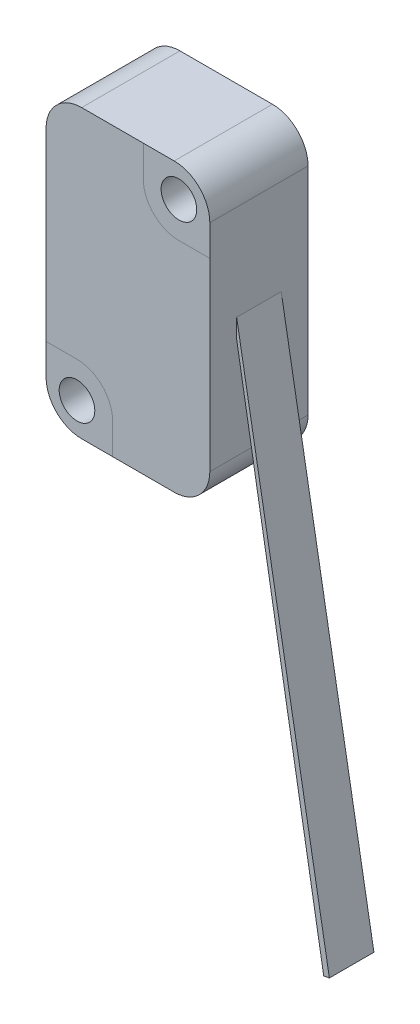
ISO-10303-21;
HEADER;
FILE_DESCRIPTION(('STEP AP214'),'2;1');
FILE_NAME('part.step','',(''),(''),'','','');
FILE_SCHEMA(('AUTOMOTIVE_DESIGN { 1 0 10303 214 1 1 1 1 }'));
ENDSEC;
DATA;
#1=APPLICATION_CONTEXT('core data for automotive mechanical design processes');
#2=APPLICATION_PROTOCOL_DEFINITION('international standard','automotive_design',2000,#1);
#3=PRODUCT_CONTEXT('',#1,'mechanical');
#4=PRODUCT('Part','Part','',(#3));
#5=PRODUCT_RELATED_PRODUCT_CATEGORY('part','',(#4));
#6=PRODUCT_DEFINITION_FORMATION('','',#4);
#7=PRODUCT_DEFINITION_CONTEXT('part definition',#1,'design');
#8=PRODUCT_DEFINITION('design','',#6,#7);
#9=PRODUCT_DEFINITION_SHAPE('','',#8);
#10=(LENGTH_UNIT() NAMED_UNIT(*) SI_UNIT(.MILLI.,.METRE.));
#11=(NAMED_UNIT(*) PLANE_ANGLE_UNIT() SI_UNIT($,.RADIAN.));
#12=(NAMED_UNIT(*) SI_UNIT($,.STERADIAN.) SOLID_ANGLE_UNIT());
#13=UNCERTAINTY_MEASURE_WITH_UNIT(LENGTH_MEASURE(1.E-05),#10,'distance_accuracy_value','');
#14=(GEOMETRIC_REPRESENTATION_CONTEXT(3) GLOBAL_UNCERTAINTY_ASSIGNED_CONTEXT((#13)) GLOBAL_UNIT_ASSIGNED_CONTEXT((#10,
#11,#12)) REPRESENTATION_CONTEXT('',''));
#15=CARTESIAN_POINT('',(0.,0.,0.));
#16=DIRECTION('',(0.,0.,1.));
#17=DIRECTION('',(1.,0.,0.));
#18=AXIS2_PLACEMENT_3D('',#15,#16,#17);
#19=CARTESIAN_POINT('',(0.,0.,4.7625));
#20=DIRECTION('',(0.,0.,-1.));
#21=DIRECTION('',(-1.,0.,0.));
#22=AXIS2_PLACEMENT_3D('',#19,#20,#21);
#23=PLANE('',#22);
#24=DIRECTION('',(-1.,0.,0.));
#25=VECTOR('',#24,1.);
#26=CARTESIAN_POINT('',(0.,-7.4549,4.7625));
#27=LINE('',#26,#25);
#28=CARTESIAN_POINT('',(-4.9403,-7.4549,4.7625));
#29=VERTEX_POINT('',#28);
#30=CARTESIAN_POINT('',(-7.9375,-7.4549,4.7625));
#31=VERTEX_POINT('',#30);
#32=EDGE_CURVE('E11',#29,#31,#27,.T.);
#33=ORIENTED_EDGE('',*,*,#32,.F.);
#34=CARTESIAN_POINT('',(-4.9403,-10.9093,4.7625));
#35=DIRECTION('',(0.,0.,-1.));
#36=DIRECTION('',(-1.,0.,0.));
#37=AXIS2_PLACEMENT_3D('',#34,#35,#36);
#38=CIRCLE('',#37,3.4544);
#39=CARTESIAN_POINT('',(-1.4859,-10.9093,4.7625));
#40=VERTEX_POINT('',#39);
#41=EDGE_CURVE('E51',#40,#29,#38,.F.);
#42=ORIENTED_EDGE('',*,*,#41,.F.);
#43=DIRECTION('',(0.,1.,0.));
#44=VECTOR('',#43,1.);
#45=CARTESIAN_POINT('',(-1.4859,0.,4.7625));
#46=LINE('',#45,#44);
#47=CARTESIAN_POINT('',(-1.4859,-13.9065,4.7625));
#48=VERTEX_POINT('',#47);
#49=EDGE_CURVE('E273',#48,#40,#46,.T.);
#50=ORIENTED_EDGE('',*,*,#49,.F.);
#51=DIRECTION('',(1.,0.,0.));
#52=VECTOR('',#51,1.);
#53=CARTESIAN_POINT('',(-7.9375,-13.9065,4.7625));
#54=LINE('',#53,#52);
#55=CARTESIAN_POINT('',(4.4831,-13.9065,4.7625));
#56=VERTEX_POINT('',#55);
#57=EDGE_CURVE('E209',#48,#56,#54,.T.);
#58=ORIENTED_EDGE('',*,*,#57,.T.);
#59=CARTESIAN_POINT('',(4.4831,-10.4521,4.7625));
#60=DIRECTION('',(0.,0.,-1.));
#61=DIRECTION('',(-1.,0.,0.));
#62=AXIS2_PLACEMENT_3D('',#59,#60,#61);
#63=CIRCLE('',#62,3.4544);
#64=CARTESIAN_POINT('',(7.9375,-10.4521,4.7625));
#65=VERTEX_POINT('',#64);
#66=EDGE_CURVE('E252',#56,#65,#63,.F.);
#67=ORIENTED_EDGE('',*,*,#66,.T.);
#68=DIRECTION('',(0.,1.,0.));
#69=VECTOR('',#68,1.);
#70=CARTESIAN_POINT('',(7.9375,-13.9065,4.7625));
#71=LINE('',#70,#69);
#72=CARTESIAN_POINT('',(7.9375,7.45489999999999,4.7625));
#73=VERTEX_POINT('',#72);
#74=EDGE_CURVE('E206',#65,#73,#71,.T.);
#75=ORIENTED_EDGE('',*,*,#74,.T.);
#76=DIRECTION('',(1.,0.,0.));
#77=VECTOR('',#76,1.);
#78=CARTESIAN_POINT('',(0.,7.4549,4.7625));
#79=LINE('',#78,#77);
#80=CARTESIAN_POINT('',(4.9403,7.4549,4.7625));
#81=VERTEX_POINT('',#80);
#82=EDGE_CURVE('E264',#81,#73,#79,.T.);
#83=ORIENTED_EDGE('',*,*,#82,.F.);
#84=CARTESIAN_POINT('',(4.9403,10.9093,4.7625));
#85=DIRECTION('',(0.,0.,-1.));
#86=DIRECTION('',(-1.,0.,0.));
#87=AXIS2_PLACEMENT_3D('',#84,#85,#86);
#88=CIRCLE('',#87,3.4544);
#89=CARTESIAN_POINT('',(1.4859,10.9093,4.7625));
#90=VERTEX_POINT('',#89);
#91=EDGE_CURVE('E267',#90,#81,#88,.F.);
#92=ORIENTED_EDGE('',*,*,#91,.F.);
#93=DIRECTION('',(0.,-1.,0.));
#94=VECTOR('',#93,1.);
#95=CARTESIAN_POINT('',(1.4859,0.,4.7625));
#96=LINE('',#95,#94);
#97=CARTESIAN_POINT('',(1.4859,13.9065,4.7625));
#98=VERTEX_POINT('',#97);
#99=EDGE_CURVE('E270',#98,#90,#96,.T.);
#100=ORIENTED_EDGE('',*,*,#99,.F.);
#101=DIRECTION('',(1.,0.,0.));
#102=VECTOR('',#101,1.);
#103=CARTESIAN_POINT('',(-7.9375,13.9065,4.7625));
#104=LINE('',#103,#102);
#105=CARTESIAN_POINT('',(-4.4831,13.9065,4.7625));
#106=VERTEX_POINT('',#105);
#107=EDGE_CURVE('E202',#106,#98,#104,.T.);
#108=ORIENTED_EDGE('',*,*,#107,.F.);
#109=CARTESIAN_POINT('',(-4.4831,10.4521,4.7625));
#110=DIRECTION('',(0.,0.,-1.));
#111=DIRECTION('',(-1.,0.,0.));
#112=AXIS2_PLACEMENT_3D('',#109,#110,#111);
#113=CIRCLE('',#112,3.4544);
#114=CARTESIAN_POINT('',(-7.9375,10.4521,4.7625));
#115=VERTEX_POINT('',#114);
#116=EDGE_CURVE('E244',#106,#115,#113,.F.);
#117=ORIENTED_EDGE('',*,*,#116,.T.);
#118=DIRECTION('',(0.,1.,0.));
#119=VECTOR('',#118,1.);
#120=CARTESIAN_POINT('',(-7.9375,-13.9065,4.7625));
#121=LINE('',#120,#119);
#122=EDGE_CURVE('E201',#31,#115,#121,.T.);
#123=ORIENTED_EDGE('',*,*,#122,.F.);
#124=EDGE_LOOP('',(#33,#42,#50,#58,#67,#75,#83,#92,#100,#108,#117,#123));
#125=FACE_BOUND('',#124,.T.);
#126=ADVANCED_FACE('F42',(#125),#23,.F.);
#127=CARTESIAN_POINT('',(-4.9403,-10.9093,4.7625));
#128=DIRECTION('',(0.,0.,1.));
#129=DIRECTION('',(1.,0.,0.));
#130=AXIS2_PLACEMENT_3D('',#127,#128,#129);
#131=CIRCLE('',#130,1.7272);
#132=CARTESIAN_POINT('',(-3.2131,-10.9093,4.7625));
#133=VERTEX_POINT('',#132);
#134=EDGE_CURVE('E355',#133,#133,#131,.T.);
#135=ORIENTED_EDGE('',*,*,#134,.F.);
#136=EDGE_LOOP('',(#135));
#137=FACE_BOUND('',#136,.T.);
#138=ORIENTED_EDGE('',*,*,#41,.T.);
#139=ORIENTED_EDGE('',*,*,#32,.T.);
#140=CARTESIAN_POINT('',(-7.9375,-10.4521,4.7625));
#141=VERTEX_POINT('',#140);
#142=EDGE_CURVE('E197',#141,#31,#121,.T.);
#143=ORIENTED_EDGE('',*,*,#142,.F.);
#144=CARTESIAN_POINT('',(-4.4831,-10.4521,4.7625));
#145=DIRECTION('',(0.,0.,-1.));
#146=DIRECTION('',(-1.,0.,0.));
#147=AXIS2_PLACEMENT_3D('',#144,#145,#146);
#148=CIRCLE('',#147,3.4544);
#149=CARTESIAN_POINT('',(-4.4831,-13.9065,4.7625));
#150=VERTEX_POINT('',#149);
#151=EDGE_CURVE('E250',#141,#150,#148,.F.);
#152=ORIENTED_EDGE('',*,*,#151,.T.);
#153=EDGE_CURVE('E210',#150,#48,#54,.T.);
#154=ORIENTED_EDGE('',*,*,#153,.T.);
#155=ORIENTED_EDGE('',*,*,#49,.T.);
#156=EDGE_LOOP('',(#138,#139,#143,#152,#154,#155));
#157=FACE_BOUND('',#156,.T.);
#158=ADVANCED_FACE('F279',(#137,#157),#23,.F.);
#159=CARTESIAN_POINT('',(-7.9375,-13.9065,4.7625));
#160=DIRECTION('',(-1.,0.,0.));
#161=DIRECTION('',(0.,0.,1.));
#162=AXIS2_PLACEMENT_3D('',#159,#160,#161);
#163=PLANE('',#162);
#164=DIRECTION('',(0.,1.,0.));
#165=VECTOR('',#164,1.);
#166=CARTESIAN_POINT('',(-7.9375,-13.9065,-4.7625));
#167=LINE('',#166,#165);
#168=CARTESIAN_POINT('',(-7.9375,-10.4521,-4.7625));
#169=VERTEX_POINT('',#168);
#170=CARTESIAN_POINT('',(-7.9375,10.4521,-4.7625));
#171=VERTEX_POINT('',#170);
#172=EDGE_CURVE('E194',#169,#171,#167,.T.);
#173=ORIENTED_EDGE('',*,*,#172,.F.);
#174=DIRECTION('',(0.,0.,-1.));
#175=VECTOR('',#174,1.);
#176=CARTESIAN_POINT('',(-7.9375,-10.4521,4.7625));
#177=LINE('',#176,#175);
#178=EDGE_CURVE('E257',#169,#141,#177,.F.);
#179=ORIENTED_EDGE('',*,*,#178,.T.);
#180=ORIENTED_EDGE('',*,*,#142,.T.);
#181=ORIENTED_EDGE('',*,*,#122,.T.);
#182=DIRECTION('',(0.,0.,-1.));
#183=VECTOR('',#182,1.);
#184=CARTESIAN_POINT('',(-7.9375,10.4521,4.7625));
#185=LINE('',#184,#183);
#186=EDGE_CURVE('E254',#115,#171,#185,.T.);
#187=ORIENTED_EDGE('',*,*,#186,.T.);
#188=EDGE_LOOP('',(#173,#179,#180,#181,#187));
#189=FACE_BOUND('',#188,.T.);
#190=ADVANCED_FACE('F315',(#189),#163,.T.);
#191=CARTESIAN_POINT('',(-7.9375,-13.9065,4.7625));
#192=DIRECTION('',(0.,1.,0.));
#193=DIRECTION('',(0.,0.,1.));
#194=AXIS2_PLACEMENT_3D('',#191,#192,#193);
#195=PLANE('',#194);
#196=DIRECTION('',(1.,0.,0.));
#197=VECTOR('',#196,1.);
#198=CARTESIAN_POINT('',(-7.9375,-13.9065,-4.7625));
#199=LINE('',#198,#197);
#200=CARTESIAN_POINT('',(-4.4831,-13.9065,-4.7625));
#201=VERTEX_POINT('',#200);
#202=CARTESIAN_POINT('',(4.4831,-13.9065,-4.7625));
#203=VERTEX_POINT('',#202);
#204=EDGE_CURVE('E222',#201,#203,#199,.T.);
#205=ORIENTED_EDGE('',*,*,#204,.T.);
#206=DIRECTION('',(0.,0.,-1.));
#207=VECTOR('',#206,1.);
#208=CARTESIAN_POINT('',(4.4831,-13.9065,4.7625));
#209=LINE('',#208,#207);
#210=EDGE_CURVE('E241',#203,#56,#209,.F.);
#211=ORIENTED_EDGE('',*,*,#210,.T.);
#212=ORIENTED_EDGE('',*,*,#57,.F.);
#213=ORIENTED_EDGE('',*,*,#153,.F.);
#214=DIRECTION('',(0.,0.,-1.));
#215=VECTOR('',#214,1.);
#216=CARTESIAN_POINT('',(-4.4831,-13.9065,-4.7625));
#217=LINE('',#216,#215);
#218=EDGE_CURVE('E238',#150,#201,#217,.T.);
#219=ORIENTED_EDGE('',*,*,#218,.T.);
#220=EDGE_LOOP('',(#205,#211,#212,#213,#219));
#221=FACE_BOUND('',#220,.T.);
#222=ADVANCED_FACE('F284',(#221),#195,.F.);
#223=CARTESIAN_POINT('',(7.9375,-13.9065,4.7625));
#224=DIRECTION('',(-1.,0.,0.));
#225=DIRECTION('',(0.,0.,1.));
#226=AXIS2_PLACEMENT_3D('',#223,#224,#225);
#227=PLANE('',#226);
#228=DIRECTION('',(0.,0.,-1.));
#229=VECTOR('',#228,1.);
#230=CARTESIAN_POINT('',(7.9375,-0.655026960812127,2.159));
#231=LINE('',#230,#229);
#232=CARTESIAN_POINT('',(7.9375,-0.655026960812134,2.159));
#233=VERTEX_POINT('',#232);
#234=CARTESIAN_POINT('',(7.9375,-0.655026960812127,-2.159));
#235=VERTEX_POINT('',#234);
#236=EDGE_CURVE('E191',#233,#235,#231,.T.);
#237=ORIENTED_EDGE('',*,*,#236,.F.);
#238=DIRECTION('',(0.,1.,0.));
#239=VECTOR('',#238,1.);
#240=CARTESIAN_POINT('',(7.9375,-0.655026960812127,2.159));
#241=LINE('',#240,#239);
#242=CARTESIAN_POINT('',(7.9375,1.2065,2.159));
#243=VERTEX_POINT('',#242);
#244=EDGE_CURVE('E175',#233,#243,#241,.T.);
#245=ORIENTED_EDGE('',*,*,#244,.T.);
#246=DIRECTION('',(0.,0.,-1.));
#247=VECTOR('',#246,1.);
#248=CARTESIAN_POINT('',(7.9375,1.2065,2.159));
#249=LINE('',#248,#247);
#250=CARTESIAN_POINT('',(7.9375,1.2065,-2.159));
#251=VERTEX_POINT('',#250);
#252=EDGE_CURVE('E163',#243,#251,#249,.T.);
#253=ORIENTED_EDGE('',*,*,#252,.T.);
#254=DIRECTION('',(0.,1.,0.));
#255=VECTOR('',#254,1.);
#256=CARTESIAN_POINT('',(7.9375,-0.655026960812127,-2.159));
#257=LINE('',#256,#255);
#258=EDGE_CURVE('E182',#235,#251,#257,.T.);
#259=ORIENTED_EDGE('',*,*,#258,.F.);
#260=EDGE_LOOP('',(#237,#245,#253,#259));
#261=FACE_BOUND('',#260,.T.);
#262=ORIENTED_EDGE('',*,*,#74,.F.);
#263=DIRECTION('',(0.,0.,-1.));
#264=VECTOR('',#263,1.);
#265=CARTESIAN_POINT('',(7.9375,-10.4521,4.7625));
#266=LINE('',#265,#264);
#267=CARTESIAN_POINT('',(7.9375,-10.4521,-4.7625));
#268=VERTEX_POINT('',#267);
#269=EDGE_CURVE('E227',#65,#268,#266,.T.);
#270=ORIENTED_EDGE('',*,*,#269,.T.);
#271=DIRECTION('',(0.,1.,0.));
#272=VECTOR('',#271,1.);
#273=CARTESIAN_POINT('',(7.9375,-13.9065,-4.7625));
#274=LINE('',#273,#272);
#275=CARTESIAN_POINT('',(7.9375,10.4521,-4.7625));
#276=VERTEX_POINT('',#275);
#277=EDGE_CURVE('E219',#268,#276,#274,.T.);
#278=ORIENTED_EDGE('',*,*,#277,.T.);
#279=DIRECTION('',(0.,0.,-1.));
#280=VECTOR('',#279,1.);
#281=CARTESIAN_POINT('',(7.9375,10.4521,4.7625));
#282=LINE('',#281,#280);
#283=CARTESIAN_POINT('',(7.9375,10.4521,4.7625));
#284=VERTEX_POINT('',#283);
#285=EDGE_CURVE('E213',#276,#284,#282,.F.);
#286=ORIENTED_EDGE('',*,*,#285,.T.);
#287=EDGE_CURVE('E205',#73,#284,#71,.T.);
#288=ORIENTED_EDGE('',*,*,#287,.F.);
#289=EDGE_LOOP('',(#262,#270,#278,#286,#288));
#290=FACE_BOUND('',#289,.T.);
#291=ADVANCED_FACE('F296',(#261,#290),#227,.F.);
#292=CARTESIAN_POINT('',(-7.9375,13.9065,4.7625));
#293=DIRECTION('',(0.,1.,0.));
#294=DIRECTION('',(0.,0.,1.));
#295=AXIS2_PLACEMENT_3D('',#292,#293,#294);
#296=PLANE('',#295);
#297=ORIENTED_EDGE('',*,*,#107,.T.);
#298=CARTESIAN_POINT('',(4.4831,13.9065,4.7625));
#299=VERTEX_POINT('',#298);
#300=EDGE_CURVE('E200',#98,#299,#104,.T.);
#301=ORIENTED_EDGE('',*,*,#300,.T.);
#302=DIRECTION('',(0.,0.,-1.));
#303=VECTOR('',#302,1.);
#304=CARTESIAN_POINT('',(4.4831,13.9065,-4.7625));
#305=LINE('',#304,#303);
#306=CARTESIAN_POINT('',(4.4831,13.9065,-4.7625));
#307=VERTEX_POINT('',#306);
#308=EDGE_CURVE('E261',#299,#307,#305,.T.);
#309=ORIENTED_EDGE('',*,*,#308,.T.);
#310=DIRECTION('',(1.,0.,0.));
#311=VECTOR('',#310,1.);
#312=CARTESIAN_POINT('',(-7.9375,13.9065,-4.7625));
#313=LINE('',#312,#311);
#314=CARTESIAN_POINT('',(-4.4831,13.9065,-4.7625));
#315=VERTEX_POINT('',#314);
#316=EDGE_CURVE('E216',#315,#307,#313,.T.);
#317=ORIENTED_EDGE('',*,*,#316,.F.);
#318=DIRECTION('',(0.,0.,-1.));
#319=VECTOR('',#318,1.);
#320=CARTESIAN_POINT('',(-4.4831,13.9065,4.7625));
#321=LINE('',#320,#319);
#322=EDGE_CURVE('E259',#315,#106,#321,.F.);
#323=ORIENTED_EDGE('',*,*,#322,.T.);
#324=EDGE_LOOP('',(#297,#301,#309,#317,#323));
#325=FACE_BOUND('',#324,.T.);
#326=ADVANCED_FACE('F308',(#325),#296,.T.);
#327=CARTESIAN_POINT('',(4.9403,10.9093,4.7625));
#328=DIRECTION('',(0.,0.,1.));
#329=DIRECTION('',(1.,0.,0.));
#330=AXIS2_PLACEMENT_3D('',#327,#328,#329);
#331=CIRCLE('',#330,1.7272);
#332=CARTESIAN_POINT('',(6.6675,10.9093,4.7625));
#333=VERTEX_POINT('',#332);
#334=EDGE_CURVE('E349',#333,#333,#331,.T.);
#335=ORIENTED_EDGE('',*,*,#334,.F.);
#336=EDGE_LOOP('',(#335));
#337=FACE_BOUND('',#336,.T.);
#338=ORIENTED_EDGE('',*,*,#300,.F.);
#339=ORIENTED_EDGE('',*,*,#99,.T.);
#340=ORIENTED_EDGE('',*,*,#91,.T.);
#341=ORIENTED_EDGE('',*,*,#82,.T.);
#342=ORIENTED_EDGE('',*,*,#287,.T.);
#343=CARTESIAN_POINT('',(4.4831,10.4521,4.7625));
#344=DIRECTION('',(0.,0.,-1.));
#345=DIRECTION('',(-1.,0.,0.));
#346=AXIS2_PLACEMENT_3D('',#343,#344,#345);
#347=CIRCLE('',#346,3.4544);
#348=EDGE_CURVE('E247',#284,#299,#347,.F.);
#349=ORIENTED_EDGE('',*,*,#348,.T.);
#350=EDGE_LOOP('',(#338,#339,#340,#341,#342,#349));
#351=FACE_BOUND('',#350,.T.);
#352=ADVANCED_FACE('F302',(#337,#351),#23,.F.);
#353=CARTESIAN_POINT('',(0.,0.,-4.7625));
#354=DIRECTION('',(0.,0.,-1.));
#355=DIRECTION('',(-1.,0.,0.));
#356=AXIS2_PLACEMENT_3D('',#353,#354,#355);
#357=PLANE('',#356);
#358=CARTESIAN_POINT('',(-4.9403,-10.9093,-4.7625));
#359=DIRECTION('',(0.,0.,1.));
#360=DIRECTION('',(1.,0.,0.));
#361=AXIS2_PLACEMENT_3D('',#358,#359,#360);
#362=CIRCLE('',#361,1.7272);
#363=CARTESIAN_POINT('',(-3.2131,-10.9093,-4.7625));
#364=VERTEX_POINT('',#363);
#365=EDGE_CURVE('E351',#364,#364,#362,.T.);
#366=ORIENTED_EDGE('',*,*,#365,.T.);
#367=EDGE_LOOP('',(#366));
#368=FACE_BOUND('',#367,.T.);
#369=CARTESIAN_POINT('',(4.9403,10.9093,-4.7625));
#370=DIRECTION('',(0.,0.,1.));
#371=DIRECTION('',(1.,0.,0.));
#372=AXIS2_PLACEMENT_3D('',#369,#370,#371);
#373=CIRCLE('',#372,1.7272);
#374=CARTESIAN_POINT('',(6.6675,10.9093,-4.7625));
#375=VERTEX_POINT('',#374);
#376=EDGE_CURVE('E186',#375,#375,#373,.T.);
#377=ORIENTED_EDGE('',*,*,#376,.T.);
#378=EDGE_LOOP('',(#377));
#379=FACE_BOUND('',#378,.T.);
#380=ORIENTED_EDGE('',*,*,#277,.F.);
#381=CARTESIAN_POINT('',(4.4831,-10.4521,-4.7625));
#382=DIRECTION('',(0.,0.,-1.));
#383=DIRECTION('',(-1.,0.,0.));
#384=AXIS2_PLACEMENT_3D('',#381,#382,#383);
#385=CIRCLE('',#384,3.4544);
#386=EDGE_CURVE('E236',#268,#203,#385,.T.);
#387=ORIENTED_EDGE('',*,*,#386,.T.);
#388=ORIENTED_EDGE('',*,*,#204,.F.);
#389=CARTESIAN_POINT('',(-4.4831,-10.4521,-4.7625));
#390=DIRECTION('',(0.,0.,-1.));
#391=DIRECTION('',(-1.,0.,0.));
#392=AXIS2_PLACEMENT_3D('',#389,#390,#391);
#393=CIRCLE('',#392,3.4544);
#394=EDGE_CURVE('E234',#201,#169,#393,.T.);
#395=ORIENTED_EDGE('',*,*,#394,.T.);
#396=ORIENTED_EDGE('',*,*,#172,.T.);
#397=CARTESIAN_POINT('',(-4.4831,10.4521,-4.7625));
#398=DIRECTION('',(0.,0.,-1.));
#399=DIRECTION('',(-1.,0.,0.));
#400=AXIS2_PLACEMENT_3D('',#397,#398,#399);
#401=CIRCLE('',#400,3.4544);
#402=EDGE_CURVE('E230',#171,#315,#401,.T.);
#403=ORIENTED_EDGE('',*,*,#402,.T.);
#404=ORIENTED_EDGE('',*,*,#316,.T.);
#405=CARTESIAN_POINT('',(4.4831,10.4521,-4.7625));
#406=DIRECTION('',(0.,0.,-1.));
#407=DIRECTION('',(-1.,0.,0.));
#408=AXIS2_PLACEMENT_3D('',#405,#406,#407);
#409=CIRCLE('',#408,3.4544);
#410=EDGE_CURVE('E232',#307,#276,#409,.T.);
#411=ORIENTED_EDGE('',*,*,#410,.T.);
#412=EDGE_LOOP('',(#380,#387,#388,#395,#396,#403,#404,#411));
#413=FACE_BOUND('',#412,.T.);
#414=ADVANCED_FACE('F321',(#368,#379,#413),#357,.T.);
#415=CARTESIAN_POINT('',(16.3761220741806,-49.8693048979079,2.159));
#416=DIRECTION('',(-0.985615954906388,-0.1690005604546,0.));
#417=DIRECTION('',(0.1690005604546,-0.985615954906388,0.));
#418=AXIS2_PLACEMENT_3D('',#415,#416,#417);
#419=PLANE('',#418);
#420=DIRECTION('',(-0.1690005604546,0.985615954906388,0.));
#421=VECTOR('',#420,1.);
#422=CARTESIAN_POINT('',(16.3761220741806,-49.8693048979079,-2.159));
#423=LINE('',#422,#421);
#424=CARTESIAN_POINT('',(16.3761220741806,-49.8693048979079,-2.159));
#425=VERTEX_POINT('',#424);
#426=EDGE_CURVE('E177',#425,#235,#423,.T.);
#427=ORIENTED_EDGE('',*,*,#426,.F.);
#428=DIRECTION('',(0.,0.,-1.));
#429=VECTOR('',#428,1.);
#430=CARTESIAN_POINT('',(16.3761220741806,-49.8693048979079,2.159));
#431=LINE('',#430,#429);
#432=CARTESIAN_POINT('',(16.3761220741806,-49.8693048979079,2.159));
#433=VERTEX_POINT('',#432);
#434=EDGE_CURVE('E162',#433,#425,#431,.T.);
#435=ORIENTED_EDGE('',*,*,#434,.F.);
#436=DIRECTION('',(-0.1690005604546,0.985615954906388,0.));
#437=VECTOR('',#436,1.);
#438=CARTESIAN_POINT('',(16.3761220741806,-49.8693048979079,2.159));
#439=LINE('',#438,#437);
#440=EDGE_CURVE('E171',#433,#233,#439,.T.);
#441=ORIENTED_EDGE('',*,*,#440,.T.);
#442=ORIENTED_EDGE('',*,*,#236,.T.);
#443=EDGE_LOOP('',(#427,#435,#441,#442));
#444=FACE_BOUND('',#443,.T.);
#445=ADVANCED_FACE('F344',(#444),#419,.T.);
#446=CARTESIAN_POINT('',(16.9264326465638,-49.7722702962276,2.159));
#447=DIRECTION('',(0.173648177666925,-0.984807753012209,0.));
#448=DIRECTION('',(0.984807753012209,0.173648177666925,0.));
#449=AXIS2_PLACEMENT_3D('',#446,#447,#448);
#450=PLANE('',#449);
#451=DIRECTION('',(-0.984807753012209,-0.173648177666925,0.));
#452=VECTOR('',#451,1.);
#453=CARTESIAN_POINT('',(16.9264326465638,-49.7722702962276,-2.159));
#454=LINE('',#453,#452);
#455=CARTESIAN_POINT('',(16.9264326465638,-49.7722702962276,-2.159));
#456=VERTEX_POINT('',#455);
#457=EDGE_CURVE('E157',#456,#425,#454,.T.);
#458=ORIENTED_EDGE('',*,*,#457,.F.);
#459=DIRECTION('',(0.,0.,-1.));
#460=VECTOR('',#459,1.);
#461=CARTESIAN_POINT('',(16.9264326465638,-49.7722702962276,2.159));
#462=LINE('',#461,#460);
#463=CARTESIAN_POINT('',(16.9264326465638,-49.7722702962276,2.159));
#464=VERTEX_POINT('',#463);
#465=EDGE_CURVE('E151',#464,#456,#462,.T.);
#466=ORIENTED_EDGE('',*,*,#465,.F.);
#467=DIRECTION('',(-0.984807753012209,-0.173648177666925,0.));
#468=VECTOR('',#467,1.);
#469=CARTESIAN_POINT('',(16.9264326465638,-49.7722702962276,2.159));
#470=LINE('',#469,#468);
#471=EDGE_CURVE('E154',#464,#433,#470,.T.);
#472=ORIENTED_EDGE('',*,*,#471,.T.);
#473=ORIENTED_EDGE('',*,*,#434,.T.);
#474=EDGE_LOOP('',(#458,#466,#472,#473));
#475=FACE_BOUND('',#474,.T.);
#476=ADVANCED_FACE('F153',(#475),#450,.T.);
#477=CARTESIAN_POINT('',(7.9375,1.2065,2.159));
#478=DIRECTION('',(0.984807753012209,0.173648177666924,0.));
#479=DIRECTION('',(-0.173648177666924,0.984807753012209,0.));
#480=AXIS2_PLACEMENT_3D('',#477,#478,#479);
#481=PLANE('',#480);
#482=DIRECTION('',(0.173648177666924,-0.984807753012209,0.));
#483=VECTOR('',#482,1.);
#484=CARTESIAN_POINT('',(7.9375,1.2065,-2.159));
#485=LINE('',#484,#483);
#486=EDGE_CURVE('E185',#251,#456,#485,.T.);
#487=ORIENTED_EDGE('',*,*,#486,.F.);
#488=ORIENTED_EDGE('',*,*,#252,.F.);
#489=DIRECTION('',(0.173648177666924,-0.984807753012209,0.));
#490=VECTOR('',#489,1.);
#491=CARTESIAN_POINT('',(7.9375,1.2065,2.159));
#492=LINE('',#491,#490);
#493=EDGE_CURVE('E169',#243,#464,#492,.T.);
#494=ORIENTED_EDGE('',*,*,#493,.T.);
#495=ORIENTED_EDGE('',*,*,#465,.T.);
#496=EDGE_LOOP('',(#487,#488,#494,#495));
#497=FACE_BOUND('',#496,.T.);
#498=ADVANCED_FACE('F174',(#497),#481,.T.);
#499=CARTESIAN_POINT('',(0.,0.,2.159));
#500=DIRECTION('',(0.,0.,1.));
#501=DIRECTION('',(1.,0.,0.));
#502=AXIS2_PLACEMENT_3D('',#499,#500,#501);
#503=PLANE('',#502);
#504=ORIENTED_EDGE('',*,*,#244,.F.);
#505=ORIENTED_EDGE('',*,*,#440,.F.);
#506=ORIENTED_EDGE('',*,*,#471,.F.);
#507=ORIENTED_EDGE('',*,*,#493,.F.);
#508=EDGE_LOOP('',(#504,#505,#506,#507));
#509=FACE_BOUND('',#508,.T.);
#510=ADVANCED_FACE('F168',(#509),#503,.T.);
#511=CARTESIAN_POINT('',(0.,0.,-2.159));
#512=DIRECTION('',(0.,0.,1.));
#513=DIRECTION('',(1.,0.,0.));
#514=AXIS2_PLACEMENT_3D('',#511,#512,#513);
#515=PLANE('',#514);
#516=ORIENTED_EDGE('',*,*,#258,.T.);
#517=ORIENTED_EDGE('',*,*,#486,.T.);
#518=ORIENTED_EDGE('',*,*,#457,.T.);
#519=ORIENTED_EDGE('',*,*,#426,.T.);
#520=EDGE_LOOP('',(#516,#517,#518,#519));
#521=FACE_BOUND('',#520,.T.);
#522=ADVANCED_FACE('F371',(#521),#515,.F.);
#523=CARTESIAN_POINT('',(4.9403,10.9093,4.7625));
#524=DIRECTION('',(0.,0.,1.));
#525=DIRECTION('',(1.,0.,0.));
#526=AXIS2_PLACEMENT_3D('',#523,#524,#525);
#527=CYLINDRICAL_SURFACE('',#526,1.7272);
#528=ORIENTED_EDGE('',*,*,#376,.F.);
#529=EDGE_LOOP('',(#528));
#530=FACE_BOUND('',#529,.T.);
#531=ORIENTED_EDGE('',*,*,#334,.T.);
#532=EDGE_LOOP('',(#531));
#533=FACE_BOUND('',#532,.T.);
#534=ADVANCED_FACE('F363',(#530,#533),#527,.F.);
#535=CARTESIAN_POINT('',(-4.9403,-10.9093,4.7625));
#536=DIRECTION('',(0.,0.,1.));
#537=DIRECTION('',(1.,0.,0.));
#538=AXIS2_PLACEMENT_3D('',#535,#536,#537);
#539=CYLINDRICAL_SURFACE('',#538,1.7272);
#540=ORIENTED_EDGE('',*,*,#365,.F.);
#541=EDGE_LOOP('',(#540));
#542=FACE_BOUND('',#541,.T.);
#543=ORIENTED_EDGE('',*,*,#134,.T.);
#544=EDGE_LOOP('',(#543));
#545=FACE_BOUND('',#544,.T.);
#546=ADVANCED_FACE('F361',(#542,#545),#539,.F.);
#547=CARTESIAN_POINT('',(4.4831,-10.4521,4.7625));
#548=DIRECTION('',(0.,0.,-1.));
#549=DIRECTION('',(-1.,0.,0.));
#550=AXIS2_PLACEMENT_3D('',#547,#548,#549);
#551=CYLINDRICAL_SURFACE('',#550,3.4544);
#552=ORIENTED_EDGE('',*,*,#66,.F.);
#553=ORIENTED_EDGE('',*,*,#210,.F.);
#554=ORIENTED_EDGE('',*,*,#386,.F.);
#555=ORIENTED_EDGE('',*,*,#269,.F.);
#556=EDGE_LOOP('',(#552,#553,#554,#555));
#557=FACE_BOUND('',#556,.T.);
#558=ADVANCED_FACE('F291',(#557),#551,.T.);
#559=CARTESIAN_POINT('',(-4.4831,-10.4521,4.7625));
#560=DIRECTION('',(0.,0.,1.));
#561=DIRECTION('',(1.,0.,0.));
#562=AXIS2_PLACEMENT_3D('',#559,#560,#561);
#563=CYLINDRICAL_SURFACE('',#562,3.4544);
#564=ORIENTED_EDGE('',*,*,#151,.F.);
#565=ORIENTED_EDGE('',*,*,#178,.F.);
#566=ORIENTED_EDGE('',*,*,#394,.F.);
#567=ORIENTED_EDGE('',*,*,#218,.F.);
#568=EDGE_LOOP('',(#564,#565,#566,#567));
#569=FACE_BOUND('',#568,.T.);
#570=ADVANCED_FACE('F319',(#569),#563,.T.);
#571=CARTESIAN_POINT('',(4.4831,10.4521,4.7625));
#572=DIRECTION('',(0.,0.,1.));
#573=DIRECTION('',(1.,0.,0.));
#574=AXIS2_PLACEMENT_3D('',#571,#572,#573);
#575=CYLINDRICAL_SURFACE('',#574,3.4544);
#576=ORIENTED_EDGE('',*,*,#348,.F.);
#577=ORIENTED_EDGE('',*,*,#285,.F.);
#578=ORIENTED_EDGE('',*,*,#410,.F.);
#579=ORIENTED_EDGE('',*,*,#308,.F.);
#580=EDGE_LOOP('',(#576,#577,#578,#579));
#581=FACE_BOUND('',#580,.T.);
#582=ADVANCED_FACE('F323',(#581),#575,.T.);
#583=CARTESIAN_POINT('',(-4.4831,10.4521,4.7625));
#584=DIRECTION('',(0.,0.,-1.));
#585=DIRECTION('',(-1.,0.,0.));
#586=AXIS2_PLACEMENT_3D('',#583,#584,#585);
#587=CYLINDRICAL_SURFACE('',#586,3.4544);
#588=ORIENTED_EDGE('',*,*,#116,.F.);
#589=ORIENTED_EDGE('',*,*,#322,.F.);
#590=ORIENTED_EDGE('',*,*,#402,.F.);
#591=ORIENTED_EDGE('',*,*,#186,.F.);
#592=EDGE_LOOP('',(#588,#589,#590,#591));
#593=FACE_BOUND('',#592,.T.);
#594=ADVANCED_FACE('F44',(#593),#587,.T.);
#595=CLOSED_SHELL('',(#126,#158,#190,#222,#291,#326,#352,#414,#445,#476,#498,#510,#522,#534,
#546,#558,#570,#582,#594));
#596=MANIFOLD_SOLID_BREP('B2',#595);
#597=ADVANCED_BREP_SHAPE_REPRESENTATION('',(#18,#596),#14);
#598=SHAPE_DEFINITION_REPRESENTATION(#9,#597);
ENDSEC;
END-ISO-10303-21;
